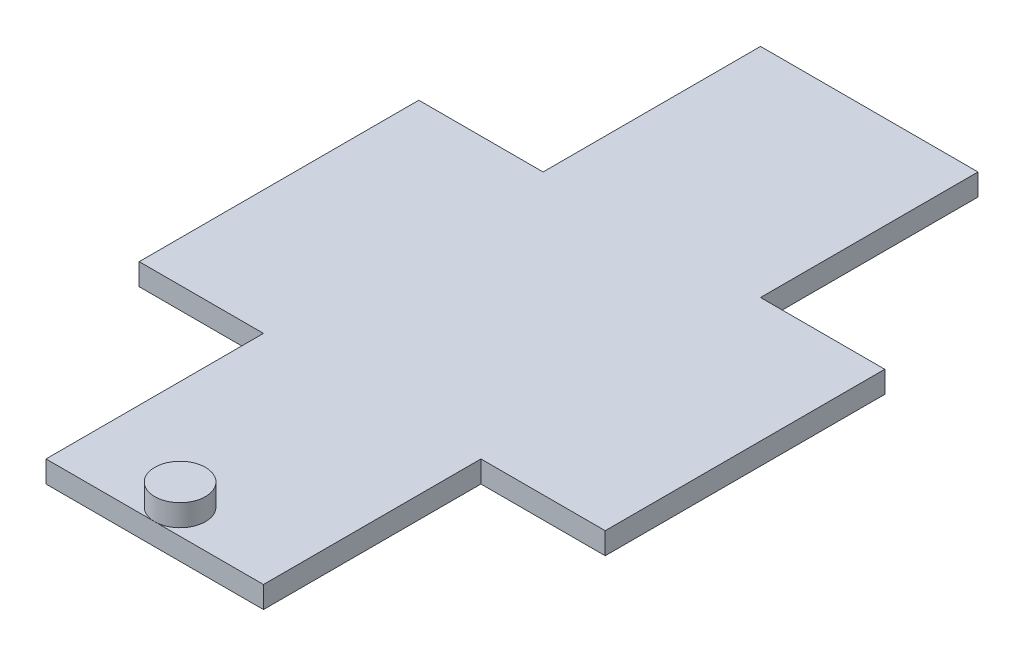
ISO-10303-21;
HEADER;
FILE_DESCRIPTION(('STEP AP214'),'2;1');
FILE_NAME('part.step','',(''),(''),'','','');
FILE_SCHEMA(('AUTOMOTIVE_DESIGN { 1 0 10303 214 1 1 1 1 }'));
ENDSEC;
DATA;
#1=APPLICATION_CONTEXT('core data for automotive mechanical design processes');
#2=APPLICATION_PROTOCOL_DEFINITION('international standard','automotive_design',2000,#1);
#3=PRODUCT_CONTEXT('',#1,'mechanical');
#4=PRODUCT('Part','Part','',(#3));
#5=PRODUCT_RELATED_PRODUCT_CATEGORY('part','',(#4));
#6=PRODUCT_DEFINITION_FORMATION('','',#4);
#7=PRODUCT_DEFINITION_CONTEXT('part definition',#1,'design');
#8=PRODUCT_DEFINITION('design','',#6,#7);
#9=PRODUCT_DEFINITION_SHAPE('','',#8);
#10=(LENGTH_UNIT() NAMED_UNIT(*) SI_UNIT(.MILLI.,.METRE.));
#11=(NAMED_UNIT(*) PLANE_ANGLE_UNIT() SI_UNIT($,.RADIAN.));
#12=(NAMED_UNIT(*) SI_UNIT($,.STERADIAN.) SOLID_ANGLE_UNIT());
#13=UNCERTAINTY_MEASURE_WITH_UNIT(LENGTH_MEASURE(1.E-05),#10,'distance_accuracy_value','');
#14=(GEOMETRIC_REPRESENTATION_CONTEXT(3) GLOBAL_UNCERTAINTY_ASSIGNED_CONTEXT((#13)) GLOBAL_UNIT_ASSIGNED_CONTEXT((#10,
#11,#12)) REPRESENTATION_CONTEXT('',''));
#15=CARTESIAN_POINT('',(0.,0.,0.));
#16=DIRECTION('',(0.,0.,1.));
#17=DIRECTION('',(1.,0.,0.));
#18=AXIS2_PLACEMENT_3D('',#15,#16,#17);
#19=CARTESIAN_POINT('',(0.,7.,-160.));
#20=DIRECTION('',(0.,0.,1.));
#21=DIRECTION('',(1.,0.,0.));
#22=AXIS2_PLACEMENT_3D('',#19,#20,#21);
#23=PLANE('',#22);
#24=DIRECTION('',(-1.,0.,0.));
#25=VECTOR('',#24,1.);
#26=CARTESIAN_POINT('',(0.,0.,-160.));
#27=LINE('',#26,#25);
#28=CARTESIAN_POINT('',(0.,0.,-160.));
#29=VERTEX_POINT('',#28);
#30=CARTESIAN_POINT('',(-40.,0.,-160.));
#31=VERTEX_POINT('',#30);
#32=EDGE_CURVE('E167',#29,#31,#27,.T.);
#33=ORIENTED_EDGE('',*,*,#32,.T.);
#34=DIRECTION('',(0.,-1.,0.));
#35=VECTOR('',#34,1.);
#36=CARTESIAN_POINT('',(-40.,7.,-160.));
#37=LINE('',#36,#35);
#38=CARTESIAN_POINT('',(-40.,7.,-160.));
#39=VERTEX_POINT('',#38);
#40=EDGE_CURVE('E11',#39,#31,#37,.T.);
#41=ORIENTED_EDGE('',*,*,#40,.F.);
#42=DIRECTION('',(-1.,0.,0.));
#43=VECTOR('',#42,1.);
#44=CARTESIAN_POINT('',(0.,7.,-160.));
#45=LINE('',#44,#43);
#46=CARTESIAN_POINT('',(0.,7.,-160.));
#47=VERTEX_POINT('',#46);
#48=EDGE_CURVE('E202',#47,#39,#45,.T.);
#49=ORIENTED_EDGE('',*,*,#48,.F.);
#50=DIRECTION('',(0.,-1.,0.));
#51=VECTOR('',#50,1.);
#52=CARTESIAN_POINT('',(0.,7.,-160.));
#53=LINE('',#52,#51);
#54=EDGE_CURVE('E163',#47,#29,#53,.T.);
#55=ORIENTED_EDGE('',*,*,#54,.T.);
#56=EDGE_LOOP('',(#33,#41,#49,#55));
#57=FACE_BOUND('',#56,.T.);
#58=ADVANCED_FACE('F39',(#57),#23,.F.);
#59=CARTESIAN_POINT('',(-40.,7.,-160.));
#60=DIRECTION('',(1.,0.,0.));
#61=DIRECTION('',(0.,0.,-1.));
#62=AXIS2_PLACEMENT_3D('',#59,#60,#61);
#63=PLANE('',#62);
#64=DIRECTION('',(0.,0.,1.));
#65=VECTOR('',#64,1.);
#66=CARTESIAN_POINT('',(-40.,0.,-160.));
#67=LINE('',#66,#65);
#68=CARTESIAN_POINT('',(-40.,0.,-69.9999999999999));
#69=VERTEX_POINT('',#68);
#70=EDGE_CURVE('E171',#31,#69,#67,.T.);
#71=ORIENTED_EDGE('',*,*,#70,.T.);
#72=DIRECTION('',(0.,-1.,0.));
#73=VECTOR('',#72,1.);
#74=CARTESIAN_POINT('',(-40.,7.,-69.9999999999999));
#75=LINE('',#74,#73);
#76=CARTESIAN_POINT('',(-40.,7.,-69.9999999999999));
#77=VERTEX_POINT('',#76);
#78=EDGE_CURVE('E48',#77,#69,#75,.T.);
#79=ORIENTED_EDGE('',*,*,#78,.F.);
#80=DIRECTION('',(0.,0.,1.));
#81=VECTOR('',#80,1.);
#82=CARTESIAN_POINT('',(-40.,7.,-160.));
#83=LINE('',#82,#81);
#84=EDGE_CURVE('E112',#39,#77,#83,.T.);
#85=ORIENTED_EDGE('',*,*,#84,.F.);
#86=ORIENTED_EDGE('',*,*,#40,.T.);
#87=EDGE_LOOP('',(#71,#79,#85,#86));
#88=FACE_BOUND('',#87,.T.);
#89=ADVANCED_FACE('F299',(#88),#63,.F.);
#90=CARTESIAN_POINT('',(0.,7.,-69.9999999999999));
#91=DIRECTION('',(0.,0.,-1.));
#92=DIRECTION('',(-1.,0.,0.));
#93=AXIS2_PLACEMENT_3D('',#90,#91,#92);
#94=PLANE('',#93);
#95=DIRECTION('',(1.,0.,0.));
#96=VECTOR('',#95,1.);
#97=CARTESIAN_POINT('',(0.,0.,-69.9999999999999));
#98=LINE('',#97,#96);
#99=CARTESIAN_POINT('',(0.,0.,-69.9999999999999));
#100=VERTEX_POINT('',#99);
#101=EDGE_CURVE('E175',#69,#100,#98,.T.);
#102=ORIENTED_EDGE('',*,*,#101,.T.);
#103=DIRECTION('',(0.,-1.,0.));
#104=VECTOR('',#103,1.);
#105=CARTESIAN_POINT('',(0.,7.,-69.9999999999999));
#106=LINE('',#105,#104);
#107=CARTESIAN_POINT('',(0.,7.,-69.9999999999999));
#108=VERTEX_POINT('',#107);
#109=EDGE_CURVE('E229',#108,#100,#106,.T.);
#110=ORIENTED_EDGE('',*,*,#109,.F.);
#111=DIRECTION('',(1.,0.,0.));
#112=VECTOR('',#111,1.);
#113=CARTESIAN_POINT('',(0.,7.,-69.9999999999999));
#114=LINE('',#113,#112);
#115=EDGE_CURVE('E239',#77,#108,#114,.T.);
#116=ORIENTED_EDGE('',*,*,#115,.F.);
#117=ORIENTED_EDGE('',*,*,#78,.T.);
#118=EDGE_LOOP('',(#102,#110,#116,#117));
#119=FACE_BOUND('',#118,.T.);
#120=ADVANCED_FACE('F237',(#119),#94,.F.);
#121=CARTESIAN_POINT('',(0.,7.,0.));
#122=DIRECTION('',(1.,0.,0.));
#123=DIRECTION('',(0.,0.,-1.));
#124=AXIS2_PLACEMENT_3D('',#121,#122,#123);
#125=PLANE('',#124);
#126=DIRECTION('',(0.,0.,1.));
#127=VECTOR('',#126,1.);
#128=CARTESIAN_POINT('',(0.,0.,0.));
#129=LINE('',#128,#127);
#130=CARTESIAN_POINT('',(0.,0.,0.));
#131=VERTEX_POINT('',#130);
#132=EDGE_CURVE('E178',#100,#131,#129,.T.);
#133=ORIENTED_EDGE('',*,*,#132,.T.);
#134=DIRECTION('',(0.,-1.,0.));
#135=VECTOR('',#134,1.);
#136=CARTESIAN_POINT('',(0.,7.,0.));
#137=LINE('',#136,#135);
#138=CARTESIAN_POINT('',(0.,7.,0.));
#139=VERTEX_POINT('',#138);
#140=EDGE_CURVE('E225',#139,#131,#137,.T.);
#141=ORIENTED_EDGE('',*,*,#140,.F.);
#142=DIRECTION('',(0.,0.,1.));
#143=VECTOR('',#142,1.);
#144=CARTESIAN_POINT('',(0.,7.,0.));
#145=LINE('',#144,#143);
#146=EDGE_CURVE('E265',#108,#139,#145,.T.);
#147=ORIENTED_EDGE('',*,*,#146,.F.);
#148=ORIENTED_EDGE('',*,*,#109,.T.);
#149=EDGE_LOOP('',(#133,#141,#147,#148));
#150=FACE_BOUND('',#149,.T.);
#151=ADVANCED_FACE('F248',(#150),#125,.F.);
#152=CARTESIAN_POINT('',(70.,7.,0.));
#153=DIRECTION('',(0.,0.,-1.));
#154=DIRECTION('',(-1.,0.,0.));
#155=AXIS2_PLACEMENT_3D('',#152,#153,#154);
#156=PLANE('',#155);
#157=DIRECTION('',(1.,0.,0.));
#158=VECTOR('',#157,1.);
#159=CARTESIAN_POINT('',(70.,0.,0.));
#160=LINE('',#159,#158);
#161=CARTESIAN_POINT('',(70.,0.,0.));
#162=VERTEX_POINT('',#161);
#163=EDGE_CURVE('E181',#131,#162,#160,.T.);
#164=ORIENTED_EDGE('',*,*,#163,.T.);
#165=DIRECTION('',(0.,-1.,0.));
#166=VECTOR('',#165,1.);
#167=CARTESIAN_POINT('',(70.,7.,0.));
#168=LINE('',#167,#166);
#169=CARTESIAN_POINT('',(70.,7.,0.));
#170=VERTEX_POINT('',#169);
#171=EDGE_CURVE('E221',#170,#162,#168,.T.);
#172=ORIENTED_EDGE('',*,*,#171,.F.);
#173=DIRECTION('',(1.,0.,0.));
#174=VECTOR('',#173,1.);
#175=CARTESIAN_POINT('',(70.,7.,0.));
#176=LINE('',#175,#174);
#177=CARTESIAN_POINT('',(35.,7.,0.));
#178=VERTEX_POINT('',#177);
#179=EDGE_CURVE('E256',#178,#170,#176,.T.);
#180=ORIENTED_EDGE('',*,*,#179,.F.);
#181=EDGE_CURVE('E255',#139,#178,#176,.T.);
#182=ORIENTED_EDGE('',*,*,#181,.F.);
#183=ORIENTED_EDGE('',*,*,#140,.T.);
#184=EDGE_LOOP('',(#164,#172,#180,#182,#183));
#185=FACE_BOUND('',#184,.T.);
#186=ADVANCED_FACE('F252',(#185),#156,.F.);
#187=CARTESIAN_POINT('',(70.,7.,0.));
#188=DIRECTION('',(-1.,0.,0.));
#189=DIRECTION('',(0.,0.,1.));
#190=AXIS2_PLACEMENT_3D('',#187,#188,#189);
#191=PLANE('',#190);
#192=DIRECTION('',(0.,0.,-1.));
#193=VECTOR('',#192,1.);
#194=CARTESIAN_POINT('',(70.,0.,0.));
#195=LINE('',#194,#193);
#196=CARTESIAN_POINT('',(70.,0.,-70.));
#197=VERTEX_POINT('',#196);
#198=EDGE_CURVE('E184',#162,#197,#195,.T.);
#199=ORIENTED_EDGE('',*,*,#198,.T.);
#200=DIRECTION('',(0.,-1.,0.));
#201=VECTOR('',#200,1.);
#202=CARTESIAN_POINT('',(70.,7.,-70.));
#203=LINE('',#202,#201);
#204=CARTESIAN_POINT('',(70.,7.,-70.));
#205=VERTEX_POINT('',#204);
#206=EDGE_CURVE('E217',#205,#197,#203,.T.);
#207=ORIENTED_EDGE('',*,*,#206,.F.);
#208=DIRECTION('',(0.,0.,-1.));
#209=VECTOR('',#208,1.);
#210=CARTESIAN_POINT('',(70.,7.,0.));
#211=LINE('',#210,#209);
#212=EDGE_CURVE('E259',#170,#205,#211,.T.);
#213=ORIENTED_EDGE('',*,*,#212,.F.);
#214=ORIENTED_EDGE('',*,*,#171,.T.);
#215=EDGE_LOOP('',(#199,#207,#213,#214));
#216=FACE_BOUND('',#215,.T.);
#217=ADVANCED_FACE('F312',(#216),#191,.F.);
#218=CARTESIAN_POINT('',(70.,7.,-70.));
#219=DIRECTION('',(0.,0.,-1.));
#220=DIRECTION('',(-1.,0.,0.));
#221=AXIS2_PLACEMENT_3D('',#218,#219,#220);
#222=PLANE('',#221);
#223=DIRECTION('',(1.,0.,0.));
#224=VECTOR('',#223,1.);
#225=CARTESIAN_POINT('',(70.,0.,-70.));
#226=LINE('',#225,#224);
#227=CARTESIAN_POINT('',(110.,0.,-70.));
#228=VERTEX_POINT('',#227);
#229=EDGE_CURVE('E187',#197,#228,#226,.T.);
#230=ORIENTED_EDGE('',*,*,#229,.T.);
#231=DIRECTION('',(0.,-1.,0.));
#232=VECTOR('',#231,1.);
#233=CARTESIAN_POINT('',(110.,7.,-70.));
#234=LINE('',#233,#232);
#235=CARTESIAN_POINT('',(110.,7.,-70.));
#236=VERTEX_POINT('',#235);
#237=EDGE_CURVE('E213',#236,#228,#234,.T.);
#238=ORIENTED_EDGE('',*,*,#237,.F.);
#239=DIRECTION('',(1.,0.,0.));
#240=VECTOR('',#239,1.);
#241=CARTESIAN_POINT('',(70.,7.,-70.));
#242=LINE('',#241,#240);
#243=EDGE_CURVE('E263',#205,#236,#242,.T.);
#244=ORIENTED_EDGE('',*,*,#243,.F.);
#245=ORIENTED_EDGE('',*,*,#206,.T.);
#246=EDGE_LOOP('',(#230,#238,#244,#245));
#247=FACE_BOUND('',#246,.T.);
#248=ADVANCED_FACE('F315',(#247),#222,.F.);
#249=CARTESIAN_POINT('',(110.,7.,-70.));
#250=DIRECTION('',(-1.,0.,0.));
#251=DIRECTION('',(0.,0.,1.));
#252=AXIS2_PLACEMENT_3D('',#249,#250,#251);
#253=PLANE('',#252);
#254=DIRECTION('',(0.,0.,-1.));
#255=VECTOR('',#254,1.);
#256=CARTESIAN_POINT('',(110.,0.,-70.));
#257=LINE('',#256,#255);
#258=CARTESIAN_POINT('',(110.,0.,-160.));
#259=VERTEX_POINT('',#258);
#260=EDGE_CURVE('E190',#228,#259,#257,.T.);
#261=ORIENTED_EDGE('',*,*,#260,.T.);
#262=DIRECTION('',(0.,-1.,0.));
#263=VECTOR('',#262,1.);
#264=CARTESIAN_POINT('',(110.,7.,-160.));
#265=LINE('',#264,#263);
#266=CARTESIAN_POINT('',(110.,7.,-160.));
#267=VERTEX_POINT('',#266);
#268=EDGE_CURVE('E209',#267,#259,#265,.T.);
#269=ORIENTED_EDGE('',*,*,#268,.F.);
#270=DIRECTION('',(0.,0.,-1.));
#271=VECTOR('',#270,1.);
#272=CARTESIAN_POINT('',(110.,7.,-70.));
#273=LINE('',#272,#271);
#274=EDGE_CURVE('E271',#236,#267,#273,.T.);
#275=ORIENTED_EDGE('',*,*,#274,.F.);
#276=ORIENTED_EDGE('',*,*,#237,.T.);
#277=EDGE_LOOP('',(#261,#269,#275,#276));
#278=FACE_BOUND('',#277,.T.);
#279=ADVANCED_FACE('F279',(#278),#253,.F.);
#280=CARTESIAN_POINT('',(70.,7.,-160.));
#281=DIRECTION('',(0.,0.,1.));
#282=DIRECTION('',(1.,0.,0.));
#283=AXIS2_PLACEMENT_3D('',#280,#281,#282);
#284=PLANE('',#283);
#285=DIRECTION('',(-1.,0.,0.));
#286=VECTOR('',#285,1.);
#287=CARTESIAN_POINT('',(70.,0.,-160.));
#288=LINE('',#287,#286);
#289=CARTESIAN_POINT('',(70.,0.,-160.));
#290=VERTEX_POINT('',#289);
#291=EDGE_CURVE('E193',#259,#290,#288,.T.);
#292=ORIENTED_EDGE('',*,*,#291,.T.);
#293=DIRECTION('',(0.,-1.,0.));
#294=VECTOR('',#293,1.);
#295=CARTESIAN_POINT('',(70.,7.,-160.));
#296=LINE('',#295,#294);
#297=CARTESIAN_POINT('',(70.,7.,-160.));
#298=VERTEX_POINT('',#297);
#299=EDGE_CURVE('E156',#298,#290,#296,.T.);
#300=ORIENTED_EDGE('',*,*,#299,.F.);
#301=DIRECTION('',(-1.,0.,0.));
#302=VECTOR('',#301,1.);
#303=CARTESIAN_POINT('',(70.,7.,-160.));
#304=LINE('',#303,#302);
#305=EDGE_CURVE('E145',#267,#298,#304,.T.);
#306=ORIENTED_EDGE('',*,*,#305,.F.);
#307=ORIENTED_EDGE('',*,*,#268,.T.);
#308=EDGE_LOOP('',(#292,#300,#306,#307));
#309=FACE_BOUND('',#308,.T.);
#310=ADVANCED_FACE('F283',(#309),#284,.F.);
#311=CARTESIAN_POINT('',(70.,7.,-230.));
#312=DIRECTION('',(-1.,0.,0.));
#313=DIRECTION('',(0.,0.,1.));
#314=AXIS2_PLACEMENT_3D('',#311,#312,#313);
#315=PLANE('',#314);
#316=DIRECTION('',(0.,0.,-1.));
#317=VECTOR('',#316,1.);
#318=CARTESIAN_POINT('',(70.,0.,-230.));
#319=LINE('',#318,#317);
#320=CARTESIAN_POINT('',(70.,0.,-230.));
#321=VERTEX_POINT('',#320);
#322=EDGE_CURVE('E154',#290,#321,#319,.T.);
#323=ORIENTED_EDGE('',*,*,#322,.T.);
#324=DIRECTION('',(0.,-1.,0.));
#325=VECTOR('',#324,1.);
#326=CARTESIAN_POINT('',(70.,7.,-230.));
#327=LINE('',#326,#325);
#328=CARTESIAN_POINT('',(70.,7.,-230.));
#329=VERTEX_POINT('',#328);
#330=EDGE_CURVE('E151',#329,#321,#327,.T.);
#331=ORIENTED_EDGE('',*,*,#330,.F.);
#332=DIRECTION('',(0.,0.,-1.));
#333=VECTOR('',#332,1.);
#334=CARTESIAN_POINT('',(70.,7.,-230.));
#335=LINE('',#334,#333);
#336=EDGE_CURVE('E138',#298,#329,#335,.T.);
#337=ORIENTED_EDGE('',*,*,#336,.F.);
#338=ORIENTED_EDGE('',*,*,#299,.T.);
#339=EDGE_LOOP('',(#323,#331,#337,#338));
#340=FACE_BOUND('',#339,.T.);
#341=ADVANCED_FACE('F152',(#340),#315,.F.);
#342=CARTESIAN_POINT('',(0.,7.,-230.));
#343=DIRECTION('',(0.,0.,1.));
#344=DIRECTION('',(1.,0.,0.));
#345=AXIS2_PLACEMENT_3D('',#342,#343,#344);
#346=PLANE('',#345);
#347=DIRECTION('',(-1.,0.,0.));
#348=VECTOR('',#347,1.);
#349=CARTESIAN_POINT('',(0.,0.,-230.));
#350=LINE('',#349,#348);
#351=CARTESIAN_POINT('',(0.,0.,-230.));
#352=VERTEX_POINT('',#351);
#353=EDGE_CURVE('E98',#321,#352,#350,.T.);
#354=ORIENTED_EDGE('',*,*,#353,.T.);
#355=DIRECTION('',(0.,-1.,0.));
#356=VECTOR('',#355,1.);
#357=CARTESIAN_POINT('',(0.,7.,-230.));
#358=LINE('',#357,#356);
#359=CARTESIAN_POINT('',(0.,7.,-230.));
#360=VERTEX_POINT('',#359);
#361=EDGE_CURVE('E157',#360,#352,#358,.T.);
#362=ORIENTED_EDGE('',*,*,#361,.F.);
#363=DIRECTION('',(-1.,0.,0.));
#364=VECTOR('',#363,1.);
#365=CARTESIAN_POINT('',(0.,7.,-230.));
#366=LINE('',#365,#364);
#367=EDGE_CURVE('E143',#329,#360,#366,.T.);
#368=ORIENTED_EDGE('',*,*,#367,.F.);
#369=ORIENTED_EDGE('',*,*,#330,.T.);
#370=EDGE_LOOP('',(#354,#362,#368,#369));
#371=FACE_BOUND('',#370,.T.);
#372=ADVANCED_FACE('F159',(#371),#346,.F.);
#373=CARTESIAN_POINT('',(0.,7.,-230.));
#374=DIRECTION('',(1.,0.,0.));
#375=DIRECTION('',(0.,0.,-1.));
#376=AXIS2_PLACEMENT_3D('',#373,#374,#375);
#377=PLANE('',#376);
#378=DIRECTION('',(0.,0.,1.));
#379=VECTOR('',#378,1.);
#380=CARTESIAN_POINT('',(0.,0.,-230.));
#381=LINE('',#380,#379);
#382=EDGE_CURVE('E104',#352,#29,#381,.T.);
#383=ORIENTED_EDGE('',*,*,#382,.T.);
#384=ORIENTED_EDGE('',*,*,#54,.F.);
#385=DIRECTION('',(0.,0.,1.));
#386=VECTOR('',#385,1.);
#387=CARTESIAN_POINT('',(0.,7.,-230.));
#388=LINE('',#387,#386);
#389=EDGE_CURVE('E56',#360,#47,#388,.T.);
#390=ORIENTED_EDGE('',*,*,#389,.F.);
#391=ORIENTED_EDGE('',*,*,#361,.T.);
#392=EDGE_LOOP('',(#383,#384,#390,#391));
#393=FACE_BOUND('',#392,.T.);
#394=ADVANCED_FACE('F287',(#393),#377,.F.);
#395=CARTESIAN_POINT('',(0.,7.,0.));
#396=DIRECTION('',(0.,1.,0.));
#397=DIRECTION('',(0.,0.,1.));
#398=AXIS2_PLACEMENT_3D('',#395,#396,#397);
#399=PLANE('',#398);
#400=ORIENTED_EDGE('',*,*,#181,.T.);
#401=CARTESIAN_POINT('',(35.,7.,-8.16425328712764));
#402=DIRECTION('',(0.,1.,0.));
#403=DIRECTION('',(0.,0.,1.));
#404=AXIS2_PLACEMENT_3D('',#401,#402,#403);
#405=CIRCLE('',#404,8.16425328712764);
#406=EDGE_CURVE('E378',#178,#178,#405,.T.);
#407=ORIENTED_EDGE('',*,*,#406,.F.);
#408=ORIENTED_EDGE('',*,*,#179,.T.);
#409=ORIENTED_EDGE('',*,*,#212,.T.);
#410=ORIENTED_EDGE('',*,*,#243,.T.);
#411=ORIENTED_EDGE('',*,*,#274,.T.);
#412=ORIENTED_EDGE('',*,*,#305,.T.);
#413=ORIENTED_EDGE('',*,*,#336,.T.);
#414=ORIENTED_EDGE('',*,*,#367,.T.);
#415=ORIENTED_EDGE('',*,*,#389,.T.);
#416=ORIENTED_EDGE('',*,*,#48,.T.);
#417=ORIENTED_EDGE('',*,*,#84,.T.);
#418=ORIENTED_EDGE('',*,*,#115,.T.);
#419=ORIENTED_EDGE('',*,*,#146,.T.);
#420=EDGE_LOOP('',(#400,#407,#408,#409,#410,#411,#412,#413,#414,#415,#416,#417,#418,#419));
#421=FACE_BOUND('',#420,.T.);
#422=ADVANCED_FACE('F141',(#421),#399,.T.);
#423=CARTESIAN_POINT('',(0.,0.,0.));
#424=DIRECTION('',(0.,1.,0.));
#425=DIRECTION('',(0.,0.,1.));
#426=AXIS2_PLACEMENT_3D('',#423,#424,#425);
#427=PLANE('',#426);
#428=ORIENTED_EDGE('',*,*,#32,.F.);
#429=ORIENTED_EDGE('',*,*,#382,.F.);
#430=ORIENTED_EDGE('',*,*,#353,.F.);
#431=ORIENTED_EDGE('',*,*,#322,.F.);
#432=ORIENTED_EDGE('',*,*,#291,.F.);
#433=ORIENTED_EDGE('',*,*,#260,.F.);
#434=ORIENTED_EDGE('',*,*,#229,.F.);
#435=ORIENTED_EDGE('',*,*,#198,.F.);
#436=ORIENTED_EDGE('',*,*,#163,.F.);
#437=ORIENTED_EDGE('',*,*,#132,.F.);
#438=ORIENTED_EDGE('',*,*,#101,.F.);
#439=ORIENTED_EDGE('',*,*,#70,.F.);
#440=EDGE_LOOP('',(#428,#429,#430,#431,#432,#433,#434,#435,#436,#437,#438,#439));
#441=FACE_BOUND('',#440,.T.);
#442=ADVANCED_FACE('F243',(#441),#427,.F.);
#443=CARTESIAN_POINT('',(35.,14.,-8.16425328712764));
#444=DIRECTION('',(0.,-1.,0.));
#445=DIRECTION('',(0.,0.,-1.));
#446=AXIS2_PLACEMENT_3D('',#443,#444,#445);
#447=CYLINDRICAL_SURFACE('',#446,8.16425328712764);
#448=CARTESIAN_POINT('',(35.,14.,-8.16425328712764));
#449=DIRECTION('',(0.,1.,0.));
#450=DIRECTION('',(0.,0.,1.));
#451=AXIS2_PLACEMENT_3D('',#448,#449,#450);
#452=CIRCLE('',#451,8.16425328712764);
#453=CARTESIAN_POINT('',(35.,14.,0.));
#454=VERTEX_POINT('',#453);
#455=EDGE_CURVE('E172',#454,#454,#452,.T.);
#456=ORIENTED_EDGE('',*,*,#455,.F.);
#457=EDGE_LOOP('',(#456));
#458=FACE_BOUND('',#457,.T.);
#459=ORIENTED_EDGE('',*,*,#406,.T.);
#460=EDGE_LOOP('',(#459));
#461=FACE_BOUND('',#460,.T.);
#462=ADVANCED_FACE('F346',(#458,#461),#447,.T.);
#463=CARTESIAN_POINT('',(35.,14.,-8.16425328712764));
#464=DIRECTION('',(0.,1.,0.));
#465=DIRECTION('',(0.,0.,1.));
#466=AXIS2_PLACEMENT_3D('',#463,#464,#465);
#467=PLANE('',#466);
#468=ORIENTED_EDGE('',*,*,#455,.T.);
#469=EDGE_LOOP('',(#468));
#470=FACE_BOUND('',#469,.T.);
#471=ADVANCED_FACE('F361',(#470),#467,.T.);
#472=CLOSED_SHELL('',(#58,#89,#120,#151,#186,#217,#248,#279,#310,#341,#372,#394,#422,#442,#462,#471));
#473=MANIFOLD_SOLID_BREP('B2',#472);
#474=ADVANCED_BREP_SHAPE_REPRESENTATION('',(#18,#473),#14);
#475=SHAPE_DEFINITION_REPRESENTATION(#9,#474);
ENDSEC;
END-ISO-10303-21;
